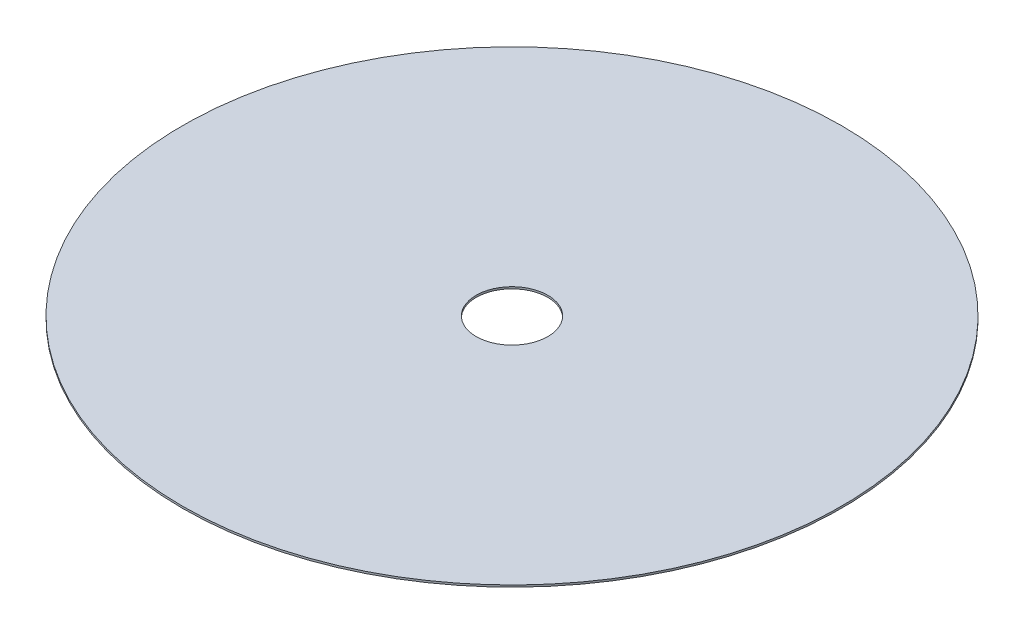
ISO-10303-21;
HEADER;
FILE_DESCRIPTION(('STEP AP214'),'2;1');
FILE_NAME('part.step','',(''),(''),'','','');
FILE_SCHEMA(('AUTOMOTIVE_DESIGN { 1 0 10303 214 1 1 1 1 }'));
ENDSEC;
DATA;
#1=APPLICATION_CONTEXT('core data for automotive mechanical design processes');
#2=APPLICATION_PROTOCOL_DEFINITION('international standard','automotive_design',2000,#1);
#3=PRODUCT_CONTEXT('',#1,'mechanical');
#4=PRODUCT('Part','Part','',(#3));
#5=PRODUCT_RELATED_PRODUCT_CATEGORY('part','',(#4));
#6=PRODUCT_DEFINITION_FORMATION('','',#4);
#7=PRODUCT_DEFINITION_CONTEXT('part definition',#1,'design');
#8=PRODUCT_DEFINITION('design','',#6,#7);
#9=PRODUCT_DEFINITION_SHAPE('','',#8);
#10=(LENGTH_UNIT() NAMED_UNIT(*) SI_UNIT(.MILLI.,.METRE.));
#11=(NAMED_UNIT(*) PLANE_ANGLE_UNIT() SI_UNIT($,.RADIAN.));
#12=(NAMED_UNIT(*) SI_UNIT($,.STERADIAN.) SOLID_ANGLE_UNIT());
#13=UNCERTAINTY_MEASURE_WITH_UNIT(LENGTH_MEASURE(1.E-05),#10,'distance_accuracy_value','');
#14=(GEOMETRIC_REPRESENTATION_CONTEXT(3) GLOBAL_UNCERTAINTY_ASSIGNED_CONTEXT((#13)) GLOBAL_UNIT_ASSIGNED_CONTEXT((#10,
#11,#12)) REPRESENTATION_CONTEXT('',''));
#15=CARTESIAN_POINT('',(0.,0.,0.));
#16=DIRECTION('',(0.,0.,1.));
#17=DIRECTION('',(1.,0.,0.));
#18=AXIS2_PLACEMENT_3D('',#15,#16,#17);
#19=CARTESIAN_POINT('',(0.,0.254,0.));
#20=DIRECTION('',(0.,1.,0.));
#21=DIRECTION('',(0.,0.,1.));
#22=AXIS2_PLACEMENT_3D('',#19,#20,#21);
#23=PLANE('',#22);
#24=CARTESIAN_POINT('',(0.,0.254,0.));
#25=DIRECTION('',(0.,1.,0.));
#26=DIRECTION('',(0.,0.,1.));
#27=AXIS2_PLACEMENT_3D('',#24,#25,#26);
#28=CIRCLE('',#27,43.815);
#29=CARTESIAN_POINT('',(0.,0.254,43.815));
#30=VERTEX_POINT('',#29);
#31=EDGE_CURVE('E10',#30,#30,#28,.T.);
#32=ORIENTED_EDGE('',*,*,#31,.T.);
#33=EDGE_LOOP('',(#32));
#34=FACE_BOUND('',#33,.T.);
#35=CARTESIAN_POINT('',(0.,0.254,0.));
#36=DIRECTION('',(0.,1.,0.));
#37=DIRECTION('',(0.,0.,1.));
#38=AXIS2_PLACEMENT_3D('',#35,#36,#37);
#39=CIRCLE('',#38,4.7625);
#40=CARTESIAN_POINT('',(0.,0.254,4.7625));
#41=VERTEX_POINT('',#40);
#42=EDGE_CURVE('E56',#41,#41,#39,.T.);
#43=ORIENTED_EDGE('',*,*,#42,.F.);
#44=EDGE_LOOP('',(#43));
#45=FACE_BOUND('',#44,.T.);
#46=ADVANCED_FACE('F43',(#34,#45),#23,.T.);
#47=CARTESIAN_POINT('',(0.,0.,0.));
#48=DIRECTION('',(0.,1.,0.));
#49=DIRECTION('',(0.,0.,1.));
#50=AXIS2_PLACEMENT_3D('',#47,#48,#49);
#51=PLANE('',#50);
#52=CARTESIAN_POINT('',(0.,0.,0.));
#53=DIRECTION('',(0.,1.,0.));
#54=DIRECTION('',(0.,0.,1.));
#55=AXIS2_PLACEMENT_3D('',#52,#53,#54);
#56=CIRCLE('',#55,43.815);
#57=CARTESIAN_POINT('',(0.,0.,43.815));
#58=VERTEX_POINT('',#57);
#59=EDGE_CURVE('E47',#58,#58,#56,.T.);
#60=ORIENTED_EDGE('',*,*,#59,.F.);
#61=EDGE_LOOP('',(#60));
#62=FACE_BOUND('',#61,.T.);
#63=CARTESIAN_POINT('',(0.,0.,0.));
#64=DIRECTION('',(0.,1.,0.));
#65=DIRECTION('',(0.,0.,1.));
#66=AXIS2_PLACEMENT_3D('',#63,#64,#65);
#67=CIRCLE('',#66,4.7625);
#68=CARTESIAN_POINT('',(0.,0.,4.7625));
#69=VERTEX_POINT('',#68);
#70=EDGE_CURVE('E58',#69,#69,#67,.T.);
#71=ORIENTED_EDGE('',*,*,#70,.T.);
#72=EDGE_LOOP('',(#71));
#73=FACE_BOUND('',#72,.T.);
#74=ADVANCED_FACE('F70',(#62,#73),#51,.F.);
#75=CARTESIAN_POINT('',(0.,0.254,0.));
#76=DIRECTION('',(0.,-1.,0.));
#77=DIRECTION('',(0.,0.,-1.));
#78=AXIS2_PLACEMENT_3D('',#75,#76,#77);
#79=CYLINDRICAL_SURFACE('',#78,43.815);
#80=ORIENTED_EDGE('',*,*,#31,.F.);
#81=EDGE_LOOP('',(#80));
#82=FACE_BOUND('',#81,.T.);
#83=ORIENTED_EDGE('',*,*,#59,.T.);
#84=EDGE_LOOP('',(#83));
#85=FACE_BOUND('',#84,.T.);
#86=ADVANCED_FACE('F45',(#82,#85),#79,.T.);
#87=CARTESIAN_POINT('',(0.,0.254,0.));
#88=DIRECTION('',(0.,-1.,0.));
#89=DIRECTION('',(0.,0.,-1.));
#90=AXIS2_PLACEMENT_3D('',#87,#88,#89);
#91=CYLINDRICAL_SURFACE('',#90,4.7625);
#92=ORIENTED_EDGE('',*,*,#42,.T.);
#93=EDGE_LOOP('',(#92));
#94=FACE_BOUND('',#93,.T.);
#95=ORIENTED_EDGE('',*,*,#70,.F.);
#96=EDGE_LOOP('',(#95));
#97=FACE_BOUND('',#96,.T.);
#98=ADVANCED_FACE('F66',(#94,#97),#91,.F.);
#99=CLOSED_SHELL('',(#46,#74,#86,#98));
#100=MANIFOLD_SOLID_BREP('B2',#99);
#101=ADVANCED_BREP_SHAPE_REPRESENTATION('',(#18,#100),#14);
#102=SHAPE_DEFINITION_REPRESENTATION(#9,#101);
ENDSEC;
END-ISO-10303-21;
